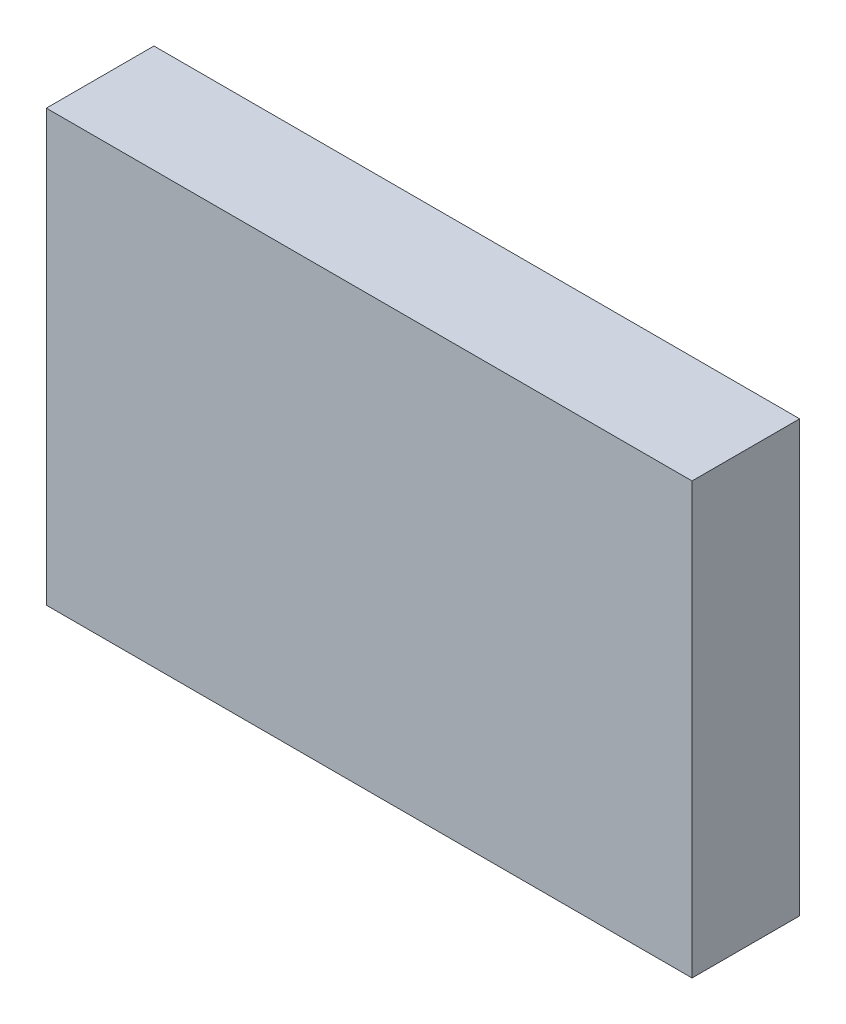
ISO-10303-21;
HEADER;
FILE_DESCRIPTION(('STEP AP214'),'2;1');
FILE_NAME('part.step','',(''),(''),'','','');
FILE_SCHEMA(('AUTOMOTIVE_DESIGN { 1 0 10303 214 1 1 1 1 }'));
ENDSEC;
DATA;
#1=APPLICATION_CONTEXT('core data for automotive mechanical design processes');
#2=APPLICATION_PROTOCOL_DEFINITION('international standard','automotive_design',2000,#1);
#3=PRODUCT_CONTEXT('',#1,'mechanical');
#4=PRODUCT('Part','Part','',(#3));
#5=PRODUCT_RELATED_PRODUCT_CATEGORY('part','',(#4));
#6=PRODUCT_DEFINITION_FORMATION('','',#4);
#7=PRODUCT_DEFINITION_CONTEXT('part definition',#1,'design');
#8=PRODUCT_DEFINITION('design','',#6,#7);
#9=PRODUCT_DEFINITION_SHAPE('','',#8);
#10=(LENGTH_UNIT() NAMED_UNIT(*) SI_UNIT(.MILLI.,.METRE.));
#11=(NAMED_UNIT(*) PLANE_ANGLE_UNIT() SI_UNIT($,.RADIAN.));
#12=(NAMED_UNIT(*) SI_UNIT($,.STERADIAN.) SOLID_ANGLE_UNIT());
#13=UNCERTAINTY_MEASURE_WITH_UNIT(LENGTH_MEASURE(1.E-05),#10,'distance_accuracy_value','');
#14=(GEOMETRIC_REPRESENTATION_CONTEXT(3) GLOBAL_UNCERTAINTY_ASSIGNED_CONTEXT((#13)) GLOBAL_UNIT_ASSIGNED_CONTEXT((#10,
#11,#12)) REPRESENTATION_CONTEXT('',''));
#15=CARTESIAN_POINT('',(0.,0.,0.));
#16=DIRECTION('',(0.,0.,1.));
#17=DIRECTION('',(1.,0.,0.));
#18=AXIS2_PLACEMENT_3D('',#15,#16,#17);
#19=CARTESIAN_POINT('',(15.,10.,5.));
#20=DIRECTION('',(-1.,0.,0.));
#21=DIRECTION('',(0.,-1.,0.));
#22=AXIS2_PLACEMENT_3D('',#19,#20,#21);
#23=PLANE('',#22);
#24=DIRECTION('',(0.,1.,0.));
#25=VECTOR('',#24,1.);
#26=CARTESIAN_POINT('',(15.,10.,0.));
#27=LINE('',#26,#25);
#28=CARTESIAN_POINT('',(15.,-10.,0.));
#29=VERTEX_POINT('',#28);
#30=CARTESIAN_POINT('',(15.,10.,0.));
#31=VERTEX_POINT('',#30);
#32=EDGE_CURVE('E95',#29,#31,#27,.T.);
#33=ORIENTED_EDGE('',*,*,#32,.T.);
#34=DIRECTION('',(0.,0.,-1.));
#35=VECTOR('',#34,1.);
#36=CARTESIAN_POINT('',(15.,10.,5.));
#37=LINE('',#36,#35);
#38=CARTESIAN_POINT('',(15.,10.,5.));
#39=VERTEX_POINT('',#38);
#40=EDGE_CURVE('E11',#39,#31,#37,.T.);
#41=ORIENTED_EDGE('',*,*,#40,.F.);
#42=DIRECTION('',(0.,1.,0.));
#43=VECTOR('',#42,1.);
#44=CARTESIAN_POINT('',(15.,10.,5.));
#45=LINE('',#44,#43);
#46=CARTESIAN_POINT('',(15.,-10.,5.));
#47=VERTEX_POINT('',#46);
#48=EDGE_CURVE('E83',#47,#39,#45,.T.);
#49=ORIENTED_EDGE('',*,*,#48,.F.);
#50=DIRECTION('',(0.,0.,-1.));
#51=VECTOR('',#50,1.);
#52=CARTESIAN_POINT('',(15.,-10.,5.));
#53=LINE('',#52,#51);
#54=EDGE_CURVE('E91',#47,#29,#53,.T.);
#55=ORIENTED_EDGE('',*,*,#54,.T.);
#56=EDGE_LOOP('',(#33,#41,#49,#55));
#57=FACE_BOUND('',#56,.T.);
#58=ADVANCED_FACE('F32',(#57),#23,.F.);
#59=CARTESIAN_POINT('',(-15.,10.,5.));
#60=DIRECTION('',(0.,-1.,0.));
#61=DIRECTION('',(0.,0.,-1.));
#62=AXIS2_PLACEMENT_3D('',#59,#60,#61);
#63=PLANE('',#62);
#64=DIRECTION('',(-1.,0.,0.));
#65=VECTOR('',#64,1.);
#66=CARTESIAN_POINT('',(-15.,10.,0.));
#67=LINE('',#66,#65);
#68=CARTESIAN_POINT('',(-15.,10.,0.));
#69=VERTEX_POINT('',#68);
#70=EDGE_CURVE('E87',#31,#69,#67,.T.);
#71=ORIENTED_EDGE('',*,*,#70,.T.);
#72=DIRECTION('',(0.,0.,-1.));
#73=VECTOR('',#72,1.);
#74=CARTESIAN_POINT('',(-15.,10.,5.));
#75=LINE('',#74,#73);
#76=CARTESIAN_POINT('',(-15.,10.,5.));
#77=VERTEX_POINT('',#76);
#78=EDGE_CURVE('E40',#77,#69,#75,.T.);
#79=ORIENTED_EDGE('',*,*,#78,.F.);
#80=DIRECTION('',(-1.,0.,0.));
#81=VECTOR('',#80,1.);
#82=CARTESIAN_POINT('',(-15.,10.,5.));
#83=LINE('',#82,#81);
#84=EDGE_CURVE('E78',#39,#77,#83,.T.);
#85=ORIENTED_EDGE('',*,*,#84,.F.);
#86=ORIENTED_EDGE('',*,*,#40,.T.);
#87=EDGE_LOOP('',(#71,#79,#85,#86));
#88=FACE_BOUND('',#87,.T.);
#89=ADVANCED_FACE('F86',(#88),#63,.F.);
#90=CARTESIAN_POINT('',(-15.,10.,5.));
#91=DIRECTION('',(1.,0.,0.));
#92=DIRECTION('',(0.,0.,-1.));
#93=AXIS2_PLACEMENT_3D('',#90,#91,#92);
#94=PLANE('',#93);
#95=DIRECTION('',(0.,-1.,0.));
#96=VECTOR('',#95,1.);
#97=CARTESIAN_POINT('',(-15.,10.,0.));
#98=LINE('',#97,#96);
#99=CARTESIAN_POINT('',(-15.,-10.,0.));
#100=VERTEX_POINT('',#99);
#101=EDGE_CURVE('E65',#69,#100,#98,.T.);
#102=ORIENTED_EDGE('',*,*,#101,.T.);
#103=DIRECTION('',(0.,0.,-1.));
#104=VECTOR('',#103,1.);
#105=CARTESIAN_POINT('',(-15.,-10.,5.));
#106=LINE('',#105,#104);
#107=CARTESIAN_POINT('',(-15.,-10.,5.));
#108=VERTEX_POINT('',#107);
#109=EDGE_CURVE('E88',#108,#100,#106,.T.);
#110=ORIENTED_EDGE('',*,*,#109,.F.);
#111=DIRECTION('',(0.,-1.,0.));
#112=VECTOR('',#111,1.);
#113=CARTESIAN_POINT('',(-15.,10.,5.));
#114=LINE('',#113,#112);
#115=EDGE_CURVE('E81',#77,#108,#114,.T.);
#116=ORIENTED_EDGE('',*,*,#115,.F.);
#117=ORIENTED_EDGE('',*,*,#78,.T.);
#118=EDGE_LOOP('',(#102,#110,#116,#117));
#119=FACE_BOUND('',#118,.T.);
#120=ADVANCED_FACE('F89',(#119),#94,.F.);
#121=CARTESIAN_POINT('',(-15.,-10.,5.));
#122=DIRECTION('',(0.,1.,0.));
#123=DIRECTION('',(0.,0.,1.));
#124=AXIS2_PLACEMENT_3D('',#121,#122,#123);
#125=PLANE('',#124);
#126=DIRECTION('',(1.,0.,0.));
#127=VECTOR('',#126,1.);
#128=CARTESIAN_POINT('',(-15.,-10.,0.));
#129=LINE('',#128,#127);
#130=EDGE_CURVE('E71',#100,#29,#129,.T.);
#131=ORIENTED_EDGE('',*,*,#130,.T.);
#132=ORIENTED_EDGE('',*,*,#54,.F.);
#133=DIRECTION('',(1.,0.,0.));
#134=VECTOR('',#133,1.);
#135=CARTESIAN_POINT('',(-15.,-10.,5.));
#136=LINE('',#135,#134);
#137=EDGE_CURVE('E48',#108,#47,#136,.T.);
#138=ORIENTED_EDGE('',*,*,#137,.F.);
#139=ORIENTED_EDGE('',*,*,#109,.T.);
#140=EDGE_LOOP('',(#131,#132,#138,#139));
#141=FACE_BOUND('',#140,.T.);
#142=ADVANCED_FACE('F102',(#141),#125,.F.);
#143=CARTESIAN_POINT('',(0.,0.,5.));
#144=DIRECTION('',(0.,0.,1.));
#145=DIRECTION('',(1.,0.,0.));
#146=AXIS2_PLACEMENT_3D('',#143,#144,#145);
#147=PLANE('',#146);
#148=ORIENTED_EDGE('',*,*,#48,.T.);
#149=ORIENTED_EDGE('',*,*,#84,.T.);
#150=ORIENTED_EDGE('',*,*,#115,.T.);
#151=ORIENTED_EDGE('',*,*,#137,.T.);
#152=EDGE_LOOP('',(#148,#149,#150,#151));
#153=FACE_BOUND('',#152,.T.);
#154=ADVANCED_FACE('F79',(#153),#147,.T.);
#155=CARTESIAN_POINT('',(0.,0.,0.));
#156=DIRECTION('',(0.,0.,1.));
#157=DIRECTION('',(1.,0.,0.));
#158=AXIS2_PLACEMENT_3D('',#155,#156,#157);
#159=PLANE('',#158);
#160=ORIENTED_EDGE('',*,*,#32,.F.);
#161=ORIENTED_EDGE('',*,*,#130,.F.);
#162=ORIENTED_EDGE('',*,*,#101,.F.);
#163=ORIENTED_EDGE('',*,*,#70,.F.);
#164=EDGE_LOOP('',(#160,#161,#162,#163));
#165=FACE_BOUND('',#164,.T.);
#166=ADVANCED_FACE('F105',(#165),#159,.F.);
#167=CLOSED_SHELL('',(#58,#89,#120,#142,#154,#166));
#168=MANIFOLD_SOLID_BREP('B2',#167);
#169=ADVANCED_BREP_SHAPE_REPRESENTATION('',(#18,#168),#14);
#170=SHAPE_DEFINITION_REPRESENTATION(#9,#169);
ENDSEC;
END-ISO-10303-21;
